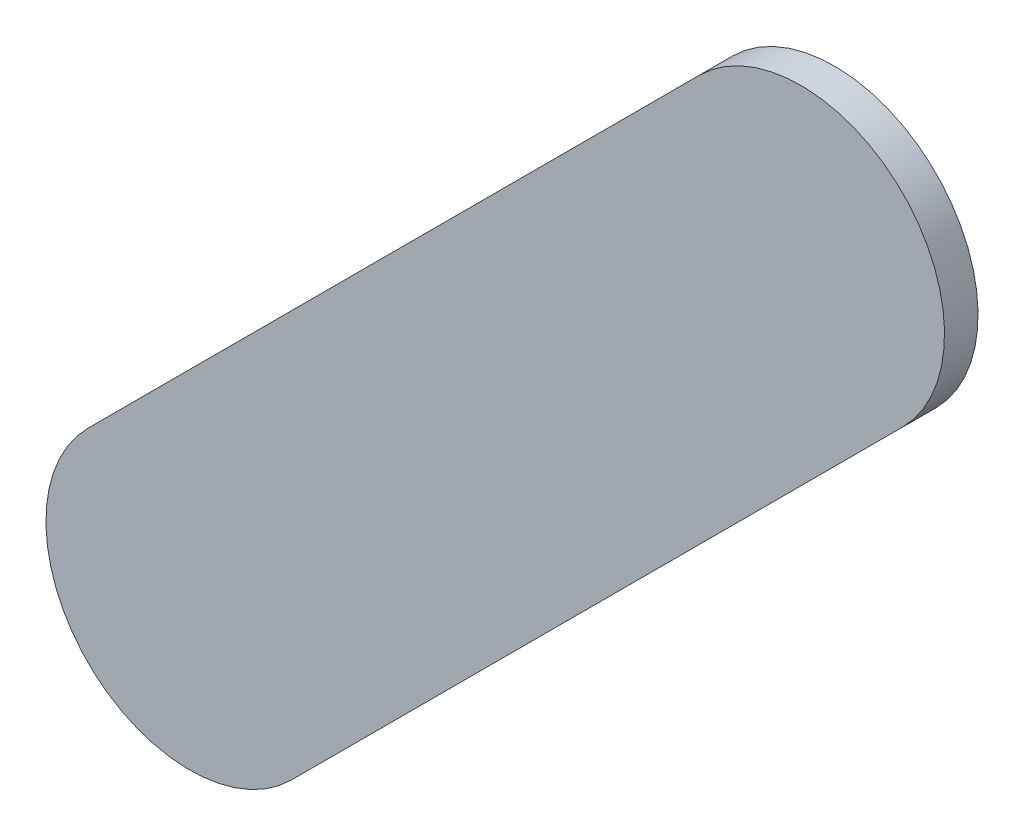
ISO-10303-21;
HEADER;
FILE_DESCRIPTION(('STEP AP214'),'2;1');
FILE_NAME('part.step','',(''),(''),'','','');
FILE_SCHEMA(('AUTOMOTIVE_DESIGN { 1 0 10303 214 1 1 1 1 }'));
ENDSEC;
DATA;
#1=APPLICATION_CONTEXT('core data for automotive mechanical design processes');
#2=APPLICATION_PROTOCOL_DEFINITION('international standard','automotive_design',2000,#1);
#3=PRODUCT_CONTEXT('',#1,'mechanical');
#4=PRODUCT('Part','Part','',(#3));
#5=PRODUCT_RELATED_PRODUCT_CATEGORY('part','',(#4));
#6=PRODUCT_DEFINITION_FORMATION('','',#4);
#7=PRODUCT_DEFINITION_CONTEXT('part definition',#1,'design');
#8=PRODUCT_DEFINITION('design','',#6,#7);
#9=PRODUCT_DEFINITION_SHAPE('','',#8);
#10=(LENGTH_UNIT() NAMED_UNIT(*) SI_UNIT(.MILLI.,.METRE.));
#11=(NAMED_UNIT(*) PLANE_ANGLE_UNIT() SI_UNIT($,.RADIAN.));
#12=(NAMED_UNIT(*) SI_UNIT($,.STERADIAN.) SOLID_ANGLE_UNIT());
#13=UNCERTAINTY_MEASURE_WITH_UNIT(LENGTH_MEASURE(1.E-05),#10,'distance_accuracy_value','');
#14=(GEOMETRIC_REPRESENTATION_CONTEXT(3) GLOBAL_UNCERTAINTY_ASSIGNED_CONTEXT((#13)) GLOBAL_UNIT_ASSIGNED_CONTEXT((#10,
#11,#12)) REPRESENTATION_CONTEXT('',''));
#15=CARTESIAN_POINT('',(0.,0.,0.));
#16=DIRECTION('',(0.,0.,1.));
#17=DIRECTION('',(1.,0.,0.));
#18=AXIS2_PLACEMENT_3D('',#15,#16,#17);
#19=CARTESIAN_POINT('',(165.997954,-69.796066,1.635));
#20=DIRECTION('',(0.,0.,1.));
#21=DIRECTION('',(1.,0.,0.));
#22=AXIS2_PLACEMENT_3D('',#19,#20,#21);
#23=PLANE('',#22);
#24=DIRECTION('',(0.707106781186548,0.707106781186548,0.));
#25=VECTOR('',#24,1.);
#26=CARTESIAN_POINT('',(165.997954,-69.796066,1.635));
#27=LINE('',#26,#25);
#28=CARTESIAN_POINT('',(165.997954,-69.796066,1.635));
#29=VERTEX_POINT('',#28);
#30=CARTESIAN_POINT('',(166.636066,-69.157954,1.635));
#31=VERTEX_POINT('',#30);
#32=EDGE_CURVE('E85',#29,#31,#27,.T.);
#33=ORIENTED_EDGE('',*,*,#32,.T.);
#34=CARTESIAN_POINT('',(166.5299995,-69.0518875,1.635));
#35=DIRECTION('',(0.,0.,1.));
#36=DIRECTION('',(0.707106781186548,-0.707106781186548,0.));
#37=AXIS2_PLACEMENT_3D('',#34,#35,#36);
#38=CIRCLE('',#37,0.150000682813);
#39=CARTESIAN_POINT('',(166.423933,-68.945821,1.635));
#40=VERTEX_POINT('',#39);
#41=EDGE_CURVE('E113',#31,#40,#38,.T.);
#42=ORIENTED_EDGE('',*,*,#41,.T.);
#43=DIRECTION('',(-0.707106781186548,-0.707106781186548,0.));
#44=VECTOR('',#43,1.);
#45=CARTESIAN_POINT('',(166.423933,-68.945821,1.635));
#46=LINE('',#45,#44);
#47=CARTESIAN_POINT('',(165.785821,-69.583933,1.635));
#48=VERTEX_POINT('',#47);
#49=EDGE_CURVE('E53',#40,#48,#46,.T.);
#50=ORIENTED_EDGE('',*,*,#49,.T.);
#51=CARTESIAN_POINT('',(165.8918875,-69.6899995,1.635));
#52=DIRECTION('',(0.,0.,1.));
#53=DIRECTION('',(-0.707106781186548,0.707106781186548,0.));
#54=AXIS2_PLACEMENT_3D('',#51,#52,#53);
#55=CIRCLE('',#54,0.150000682813);
#56=EDGE_CURVE('E11',#48,#29,#55,.T.);
#57=ORIENTED_EDGE('',*,*,#56,.T.);
#58=EDGE_LOOP('',(#33,#42,#50,#57));
#59=FACE_BOUND('',#58,.T.);
#60=ADVANCED_FACE('F17',(#59),#23,.T.);
#61=CARTESIAN_POINT('',(165.997954,-69.796066,1.6));
#62=DIRECTION('',(0.,0.,1.));
#63=DIRECTION('',(1.,0.,0.));
#64=AXIS2_PLACEMENT_3D('',#61,#62,#63);
#65=PLANE('',#64);
#66=CARTESIAN_POINT('',(165.8918875,-69.6899995,1.6));
#67=DIRECTION('',(0.,0.,1.));
#68=DIRECTION('',(-0.707106781186548,0.707106781186548,0.));
#69=AXIS2_PLACEMENT_3D('',#66,#67,#68);
#70=CIRCLE('',#69,0.150000682813);
#71=CARTESIAN_POINT('',(165.785821,-69.583933,1.6));
#72=VERTEX_POINT('',#71);
#73=CARTESIAN_POINT('',(165.997954,-69.796066,1.6));
#74=VERTEX_POINT('',#73);
#75=EDGE_CURVE('E26',#72,#74,#70,.T.);
#76=ORIENTED_EDGE('',*,*,#75,.F.);
#77=DIRECTION('',(-0.707106781186548,-0.707106781186548,0.));
#78=VECTOR('',#77,1.);
#79=CARTESIAN_POINT('',(166.423933,-68.945821,1.6));
#80=LINE('',#79,#78);
#81=CARTESIAN_POINT('',(166.423933,-68.945821,1.6));
#82=VERTEX_POINT('',#81);
#83=EDGE_CURVE('E62',#82,#72,#80,.T.);
#84=ORIENTED_EDGE('',*,*,#83,.F.);
#85=CARTESIAN_POINT('',(166.5299995,-69.0518875,1.6));
#86=DIRECTION('',(0.,0.,1.));
#87=DIRECTION('',(0.707106781186548,-0.707106781186548,0.));
#88=AXIS2_PLACEMENT_3D('',#85,#86,#87);
#89=CIRCLE('',#88,0.150000682813);
#90=CARTESIAN_POINT('',(166.636066,-69.157954,1.6));
#91=VERTEX_POINT('',#90);
#92=EDGE_CURVE('E87',#91,#82,#89,.T.);
#93=ORIENTED_EDGE('',*,*,#92,.F.);
#94=DIRECTION('',(0.707106781186548,0.707106781186548,0.));
#95=VECTOR('',#94,1.);
#96=CARTESIAN_POINT('',(165.997954,-69.796066,1.6));
#97=LINE('',#96,#95);
#98=EDGE_CURVE('E83',#74,#91,#97,.T.);
#99=ORIENTED_EDGE('',*,*,#98,.F.);
#100=EDGE_LOOP('',(#76,#84,#93,#99));
#101=FACE_BOUND('',#100,.T.);
#102=ADVANCED_FACE('F89',(#101),#65,.F.);
#103=CARTESIAN_POINT('',(165.8918875,-69.6899995,1.6));
#104=DIRECTION('',(0.,0.,-1.));
#105=DIRECTION('',(-0.707106781186548,0.707106781186548,0.));
#106=AXIS2_PLACEMENT_3D('',#103,#104,#105);
#107=CYLINDRICAL_SURFACE('',#106,0.150000682813);
#108=ORIENTED_EDGE('',*,*,#75,.T.);
#109=DIRECTION('',(0.,0.,1.));
#110=VECTOR('',#109,1.);
#111=CARTESIAN_POINT('',(165.997954,-69.796066,1.6));
#112=LINE('',#111,#110);
#113=EDGE_CURVE('E73',#74,#29,#112,.T.);
#114=ORIENTED_EDGE('',*,*,#113,.T.);
#115=ORIENTED_EDGE('',*,*,#56,.F.);
#116=DIRECTION('',(0.,0.,1.));
#117=VECTOR('',#116,1.);
#118=CARTESIAN_POINT('',(165.785821,-69.583933,1.6));
#119=LINE('',#118,#117);
#120=EDGE_CURVE('E75',#72,#48,#119,.T.);
#121=ORIENTED_EDGE('',*,*,#120,.F.);
#122=EDGE_LOOP('',(#108,#114,#115,#121));
#123=FACE_BOUND('',#122,.T.);
#124=ADVANCED_FACE('F72',(#123),#107,.T.);
#125=CARTESIAN_POINT('',(166.423933,-68.945821,1.6));
#126=DIRECTION('',(0.707106781186548,-0.707106781186548,0.));
#127=DIRECTION('',(0.,0.,-1.));
#128=AXIS2_PLACEMENT_3D('',#125,#126,#127);
#129=PLANE('',#128);
#130=ORIENTED_EDGE('',*,*,#83,.T.);
#131=ORIENTED_EDGE('',*,*,#120,.T.);
#132=ORIENTED_EDGE('',*,*,#49,.F.);
#133=DIRECTION('',(0.,0.,1.));
#134=VECTOR('',#133,1.);
#135=CARTESIAN_POINT('',(166.423933,-68.945821,1.6));
#136=LINE('',#135,#134);
#137=EDGE_CURVE('E106',#82,#40,#136,.T.);
#138=ORIENTED_EDGE('',*,*,#137,.F.);
#139=EDGE_LOOP('',(#130,#131,#132,#138));
#140=FACE_BOUND('',#139,.T.);
#141=ADVANCED_FACE('F118',(#140),#129,.F.);
#142=CARTESIAN_POINT('',(166.5299995,-69.0518875,1.6));
#143=DIRECTION('',(0.,0.,-1.));
#144=DIRECTION('',(0.707106781186548,-0.707106781186548,0.));
#145=AXIS2_PLACEMENT_3D('',#142,#143,#144);
#146=CYLINDRICAL_SURFACE('',#145,0.150000682813);
#147=ORIENTED_EDGE('',*,*,#92,.T.);
#148=ORIENTED_EDGE('',*,*,#137,.T.);
#149=ORIENTED_EDGE('',*,*,#41,.F.);
#150=DIRECTION('',(0.,0.,1.));
#151=VECTOR('',#150,1.);
#152=CARTESIAN_POINT('',(166.636066,-69.157954,1.6));
#153=LINE('',#152,#151);
#154=EDGE_CURVE('E93',#91,#31,#153,.T.);
#155=ORIENTED_EDGE('',*,*,#154,.F.);
#156=EDGE_LOOP('',(#147,#148,#149,#155));
#157=FACE_BOUND('',#156,.T.);
#158=ADVANCED_FACE('F121',(#157),#146,.T.);
#159=CARTESIAN_POINT('',(165.997954,-69.796066,1.6));
#160=DIRECTION('',(-0.707106781186548,0.707106781186548,0.));
#161=DIRECTION('',(0.,0.,1.));
#162=AXIS2_PLACEMENT_3D('',#159,#160,#161);
#163=PLANE('',#162);
#164=ORIENTED_EDGE('',*,*,#98,.T.);
#165=ORIENTED_EDGE('',*,*,#154,.T.);
#166=ORIENTED_EDGE('',*,*,#32,.F.);
#167=ORIENTED_EDGE('',*,*,#113,.F.);
#168=EDGE_LOOP('',(#164,#165,#166,#167));
#169=FACE_BOUND('',#168,.T.);
#170=ADVANCED_FACE('F81',(#169),#163,.F.);
#171=CLOSED_SHELL('',(#60,#102,#124,#141,#158,#170));
#172=MANIFOLD_SOLID_BREP('B1',#171);
#173=ADVANCED_BREP_SHAPE_REPRESENTATION('',(#18,#172),#14);
#174=SHAPE_DEFINITION_REPRESENTATION(#9,#173);
ENDSEC;
END-ISO-10303-21;
